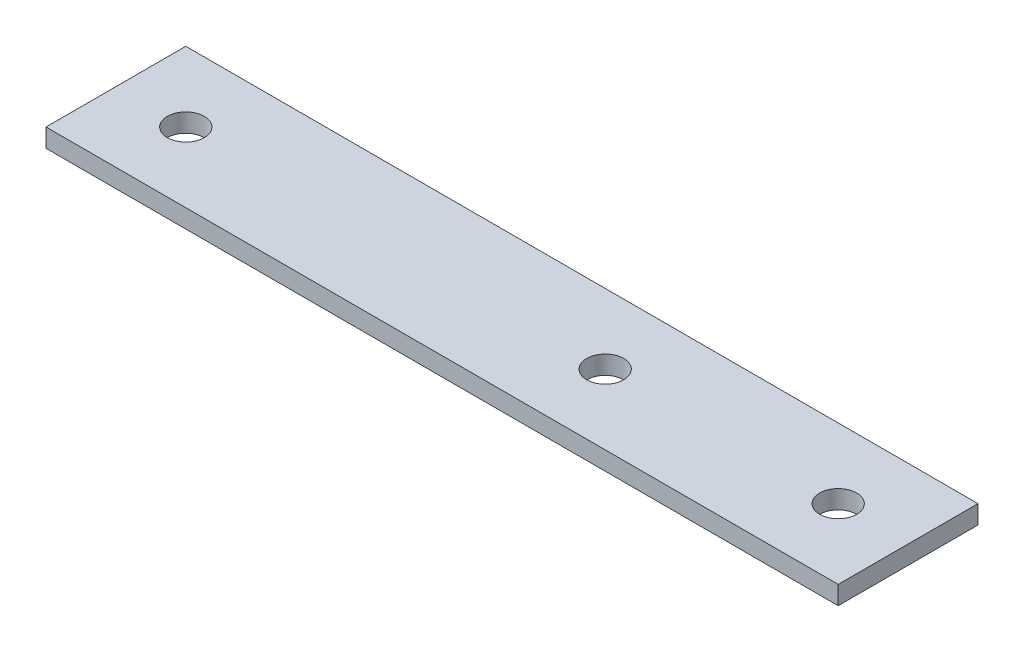
ISO-10303-21;
HEADER;
FILE_DESCRIPTION(('STEP AP214'),'2;1');
FILE_NAME('part.step','',(''),(''),'','','');
FILE_SCHEMA(('AUTOMOTIVE_DESIGN { 1 0 10303 214 1 1 1 1 }'));
ENDSEC;
DATA;
#1=APPLICATION_CONTEXT('core data for automotive mechanical design processes');
#2=APPLICATION_PROTOCOL_DEFINITION('international standard','automotive_design',2000,#1);
#3=PRODUCT_CONTEXT('',#1,'mechanical');
#4=PRODUCT('Part','Part','',(#3));
#5=PRODUCT_RELATED_PRODUCT_CATEGORY('part','',(#4));
#6=PRODUCT_DEFINITION_FORMATION('','',#4);
#7=PRODUCT_DEFINITION_CONTEXT('part definition',#1,'design');
#8=PRODUCT_DEFINITION('design','',#6,#7);
#9=PRODUCT_DEFINITION_SHAPE('','',#8);
#10=(LENGTH_UNIT() NAMED_UNIT(*) SI_UNIT(.MILLI.,.METRE.));
#11=(NAMED_UNIT(*) PLANE_ANGLE_UNIT() SI_UNIT($,.RADIAN.));
#12=(NAMED_UNIT(*) SI_UNIT($,.STERADIAN.) SOLID_ANGLE_UNIT());
#13=UNCERTAINTY_MEASURE_WITH_UNIT(LENGTH_MEASURE(1.E-05),#10,'distance_accuracy_value','');
#14=(GEOMETRIC_REPRESENTATION_CONTEXT(3) GLOBAL_UNCERTAINTY_ASSIGNED_CONTEXT((#13)) GLOBAL_UNIT_ASSIGNED_CONTEXT((#10,
#11,#12)) REPRESENTATION_CONTEXT('',''));
#15=CARTESIAN_POINT('',(0.,0.,0.));
#16=DIRECTION('',(0.,0.,1.));
#17=DIRECTION('',(1.,0.,0.));
#18=AXIS2_PLACEMENT_3D('',#15,#16,#17);
#19=CARTESIAN_POINT('',(0.,0.79375,0.));
#20=DIRECTION('',(0.,1.,0.));
#21=DIRECTION('',(0.,0.,1.));
#22=AXIS2_PLACEMENT_3D('',#19,#20,#21);
#23=PLANE('',#22);
#24=CARTESIAN_POINT('',(28.,0.79375,0.));
#25=DIRECTION('',(0.,1.,0.));
#26=DIRECTION('',(0.,0.,1.));
#27=AXIS2_PLACEMENT_3D('',#24,#25,#26);
#28=CIRCLE('',#27,1.5875);
#29=CARTESIAN_POINT('',(28.,0.79375,1.5875));
#30=VERTEX_POINT('',#29);
#31=EDGE_CURVE('E114',#30,#30,#28,.T.);
#32=ORIENTED_EDGE('',*,*,#31,.F.);
#33=EDGE_LOOP('',(#32));
#34=FACE_BOUND('',#33,.T.);
#35=DIRECTION('',(0.,0.,1.));
#36=VECTOR('',#35,1.);
#37=CARTESIAN_POINT('',(-34.,0.79375,6.));
#38=LINE('',#37,#36);
#39=CARTESIAN_POINT('',(-34.,0.79375,-6.));
#40=VERTEX_POINT('',#39);
#41=CARTESIAN_POINT('',(-34.,0.79375,6.));
#42=VERTEX_POINT('',#41);
#43=EDGE_CURVE('E84',#40,#42,#38,.T.);
#44=ORIENTED_EDGE('',*,*,#43,.T.);
#45=DIRECTION('',(1.,0.,0.));
#46=VECTOR('',#45,1.);
#47=CARTESIAN_POINT('',(34.,0.79375,6.));
#48=LINE('',#47,#46);
#49=CARTESIAN_POINT('',(34.,0.79375,6.));
#50=VERTEX_POINT('',#49);
#51=EDGE_CURVE('E79',#42,#50,#48,.T.);
#52=ORIENTED_EDGE('',*,*,#51,.T.);
#53=DIRECTION('',(0.,0.,-1.));
#54=VECTOR('',#53,1.);
#55=CARTESIAN_POINT('',(34.,0.79375,6.));
#56=LINE('',#55,#54);
#57=CARTESIAN_POINT('',(34.,0.79375,-6.));
#58=VERTEX_POINT('',#57);
#59=EDGE_CURVE('E82',#50,#58,#56,.T.);
#60=ORIENTED_EDGE('',*,*,#59,.T.);
#61=DIRECTION('',(-1.,0.,0.));
#62=VECTOR('',#61,1.);
#63=CARTESIAN_POINT('',(34.,0.79375,-6.));
#64=LINE('',#63,#62);
#65=EDGE_CURVE('E49',#58,#40,#64,.T.);
#66=ORIENTED_EDGE('',*,*,#65,.T.);
#67=EDGE_LOOP('',(#44,#52,#60,#66));
#68=FACE_BOUND('',#67,.T.);
#69=CARTESIAN_POINT('',(-28.,0.79375,0.));
#70=DIRECTION('',(0.,1.,0.));
#71=DIRECTION('',(0.,0.,1.));
#72=AXIS2_PLACEMENT_3D('',#69,#70,#71);
#73=CIRCLE('',#72,1.5875);
#74=CARTESIAN_POINT('',(-28.,0.79375,1.5875));
#75=VERTEX_POINT('',#74);
#76=EDGE_CURVE('E99',#75,#75,#73,.T.);
#77=ORIENTED_EDGE('',*,*,#76,.F.);
#78=EDGE_LOOP('',(#77));
#79=FACE_BOUND('',#78,.T.);
#80=CARTESIAN_POINT('',(8.,0.79375,0.));
#81=DIRECTION('',(0.,1.,0.));
#82=DIRECTION('',(0.,0.,1.));
#83=AXIS2_PLACEMENT_3D('',#80,#81,#82);
#84=CIRCLE('',#83,1.5875);
#85=CARTESIAN_POINT('',(8.,0.79375,1.5875));
#86=VERTEX_POINT('',#85);
#87=EDGE_CURVE('E120',#86,#86,#84,.T.);
#88=ORIENTED_EDGE('',*,*,#87,.F.);
#89=EDGE_LOOP('',(#88));
#90=FACE_BOUND('',#89,.T.);
#91=ADVANCED_FACE('F32',(#34,#68,#79,#90),#23,.T.);
#92=CARTESIAN_POINT('',(0.,-0.79375,0.));
#93=DIRECTION('',(0.,1.,0.));
#94=DIRECTION('',(0.,0.,1.));
#95=AXIS2_PLACEMENT_3D('',#92,#93,#94);
#96=PLANE('',#95);
#97=CARTESIAN_POINT('',(28.,-0.79375,0.));
#98=DIRECTION('',(0.,1.,0.));
#99=DIRECTION('',(0.,0.,1.));
#100=AXIS2_PLACEMENT_3D('',#97,#98,#99);
#101=CIRCLE('',#100,1.5875);
#102=CARTESIAN_POINT('',(28.,-0.79375,1.5875));
#103=VERTEX_POINT('',#102);
#104=EDGE_CURVE('E117',#103,#103,#101,.T.);
#105=ORIENTED_EDGE('',*,*,#104,.T.);
#106=EDGE_LOOP('',(#105));
#107=FACE_BOUND('',#106,.T.);
#108=DIRECTION('',(0.,0.,1.));
#109=VECTOR('',#108,1.);
#110=CARTESIAN_POINT('',(-34.,-0.79375,6.));
#111=LINE('',#110,#109);
#112=CARTESIAN_POINT('',(-34.,-0.79375,-6.));
#113=VERTEX_POINT('',#112);
#114=CARTESIAN_POINT('',(-34.,-0.79375,6.));
#115=VERTEX_POINT('',#114);
#116=EDGE_CURVE('E96',#113,#115,#111,.T.);
#117=ORIENTED_EDGE('',*,*,#116,.F.);
#118=DIRECTION('',(-1.,0.,0.));
#119=VECTOR('',#118,1.);
#120=CARTESIAN_POINT('',(34.,-0.79375,-6.));
#121=LINE('',#120,#119);
#122=CARTESIAN_POINT('',(34.,-0.79375,-6.));
#123=VERTEX_POINT('',#122);
#124=EDGE_CURVE('E72',#123,#113,#121,.T.);
#125=ORIENTED_EDGE('',*,*,#124,.F.);
#126=DIRECTION('',(0.,0.,-1.));
#127=VECTOR('',#126,1.);
#128=CARTESIAN_POINT('',(34.,-0.79375,6.));
#129=LINE('',#128,#127);
#130=CARTESIAN_POINT('',(34.,-0.79375,6.));
#131=VERTEX_POINT('',#130);
#132=EDGE_CURVE('E66',#131,#123,#129,.T.);
#133=ORIENTED_EDGE('',*,*,#132,.F.);
#134=DIRECTION('',(1.,0.,0.));
#135=VECTOR('',#134,1.);
#136=CARTESIAN_POINT('',(34.,-0.79375,6.));
#137=LINE('',#136,#135);
#138=EDGE_CURVE('E88',#115,#131,#137,.T.);
#139=ORIENTED_EDGE('',*,*,#138,.F.);
#140=EDGE_LOOP('',(#117,#125,#133,#139));
#141=FACE_BOUND('',#140,.T.);
#142=CARTESIAN_POINT('',(-28.,-0.79375,0.));
#143=DIRECTION('',(0.,1.,0.));
#144=DIRECTION('',(0.,0.,1.));
#145=AXIS2_PLACEMENT_3D('',#142,#143,#144);
#146=CIRCLE('',#145,1.5875);
#147=CARTESIAN_POINT('',(-28.,-0.79375,1.5875));
#148=VERTEX_POINT('',#147);
#149=EDGE_CURVE('E111',#148,#148,#146,.T.);
#150=ORIENTED_EDGE('',*,*,#149,.T.);
#151=EDGE_LOOP('',(#150));
#152=FACE_BOUND('',#151,.T.);
#153=CARTESIAN_POINT('',(8.,-0.79375,0.));
#154=DIRECTION('',(0.,1.,0.));
#155=DIRECTION('',(0.,0.,1.));
#156=AXIS2_PLACEMENT_3D('',#153,#154,#155);
#157=CIRCLE('',#156,1.5875);
#158=CARTESIAN_POINT('',(8.,-0.79375,1.5875));
#159=VERTEX_POINT('',#158);
#160=EDGE_CURVE('E123',#159,#159,#157,.T.);
#161=ORIENTED_EDGE('',*,*,#160,.T.);
#162=EDGE_LOOP('',(#161));
#163=FACE_BOUND('',#162,.T.);
#164=ADVANCED_FACE('F107',(#107,#141,#152,#163),#96,.F.);
#165=CARTESIAN_POINT('',(-34.,0.79375,6.));
#166=DIRECTION('',(1.,0.,0.));
#167=DIRECTION('',(0.,0.,-1.));
#168=AXIS2_PLACEMENT_3D('',#165,#166,#167);
#169=PLANE('',#168);
#170=ORIENTED_EDGE('',*,*,#116,.T.);
#171=DIRECTION('',(0.,-1.,0.));
#172=VECTOR('',#171,1.);
#173=CARTESIAN_POINT('',(-34.,0.79375,6.));
#174=LINE('',#173,#172);
#175=EDGE_CURVE('E11',#42,#115,#174,.T.);
#176=ORIENTED_EDGE('',*,*,#175,.F.);
#177=ORIENTED_EDGE('',*,*,#43,.F.);
#178=DIRECTION('',(0.,-1.,0.));
#179=VECTOR('',#178,1.);
#180=CARTESIAN_POINT('',(-34.,0.79375,-6.));
#181=LINE('',#180,#179);
#182=EDGE_CURVE('E92',#40,#113,#181,.T.);
#183=ORIENTED_EDGE('',*,*,#182,.T.);
#184=EDGE_LOOP('',(#170,#176,#177,#183));
#185=FACE_BOUND('',#184,.T.);
#186=ADVANCED_FACE('F34',(#185),#169,.F.);
#187=CARTESIAN_POINT('',(34.,0.79375,6.));
#188=DIRECTION('',(0.,0.,-1.));
#189=DIRECTION('',(-1.,0.,0.));
#190=AXIS2_PLACEMENT_3D('',#187,#188,#189);
#191=PLANE('',#190);
#192=ORIENTED_EDGE('',*,*,#138,.T.);
#193=DIRECTION('',(0.,-1.,0.));
#194=VECTOR('',#193,1.);
#195=CARTESIAN_POINT('',(34.,0.79375,6.));
#196=LINE('',#195,#194);
#197=EDGE_CURVE('E41',#50,#131,#196,.T.);
#198=ORIENTED_EDGE('',*,*,#197,.F.);
#199=ORIENTED_EDGE('',*,*,#51,.F.);
#200=ORIENTED_EDGE('',*,*,#175,.T.);
#201=EDGE_LOOP('',(#192,#198,#199,#200));
#202=FACE_BOUND('',#201,.T.);
#203=ADVANCED_FACE('F87',(#202),#191,.F.);
#204=CARTESIAN_POINT('',(34.,0.79375,6.));
#205=DIRECTION('',(-1.,0.,0.));
#206=DIRECTION('',(0.,0.,1.));
#207=AXIS2_PLACEMENT_3D('',#204,#205,#206);
#208=PLANE('',#207);
#209=ORIENTED_EDGE('',*,*,#132,.T.);
#210=DIRECTION('',(0.,-1.,0.));
#211=VECTOR('',#210,1.);
#212=CARTESIAN_POINT('',(34.,0.79375,-6.));
#213=LINE('',#212,#211);
#214=EDGE_CURVE('E89',#58,#123,#213,.T.);
#215=ORIENTED_EDGE('',*,*,#214,.F.);
#216=ORIENTED_EDGE('',*,*,#59,.F.);
#217=ORIENTED_EDGE('',*,*,#197,.T.);
#218=EDGE_LOOP('',(#209,#215,#216,#217));
#219=FACE_BOUND('',#218,.T.);
#220=ADVANCED_FACE('F90',(#219),#208,.F.);
#221=CARTESIAN_POINT('',(34.,0.79375,-6.));
#222=DIRECTION('',(0.,0.,1.));
#223=DIRECTION('',(1.,0.,0.));
#224=AXIS2_PLACEMENT_3D('',#221,#222,#223);
#225=PLANE('',#224);
#226=ORIENTED_EDGE('',*,*,#124,.T.);
#227=ORIENTED_EDGE('',*,*,#182,.F.);
#228=ORIENTED_EDGE('',*,*,#65,.F.);
#229=ORIENTED_EDGE('',*,*,#214,.T.);
#230=EDGE_LOOP('',(#226,#227,#228,#229));
#231=FACE_BOUND('',#230,.T.);
#232=ADVANCED_FACE('F104',(#231),#225,.F.);
#233=CARTESIAN_POINT('',(-28.,0.79375,0.));
#234=DIRECTION('',(0.,-1.,0.));
#235=DIRECTION('',(0.,0.,-1.));
#236=AXIS2_PLACEMENT_3D('',#233,#234,#235);
#237=CYLINDRICAL_SURFACE('',#236,1.5875);
#238=ORIENTED_EDGE('',*,*,#76,.T.);
#239=EDGE_LOOP('',(#238));
#240=FACE_BOUND('',#239,.T.);
#241=ORIENTED_EDGE('',*,*,#149,.F.);
#242=EDGE_LOOP('',(#241));
#243=FACE_BOUND('',#242,.T.);
#244=ADVANCED_FACE('F142',(#240,#243),#237,.F.);
#245=CARTESIAN_POINT('',(28.,0.79375,0.));
#246=DIRECTION('',(0.,-1.,0.));
#247=DIRECTION('',(0.,0.,-1.));
#248=AXIS2_PLACEMENT_3D('',#245,#246,#247);
#249=CYLINDRICAL_SURFACE('',#248,1.5875);
#250=ORIENTED_EDGE('',*,*,#31,.T.);
#251=EDGE_LOOP('',(#250));
#252=FACE_BOUND('',#251,.T.);
#253=ORIENTED_EDGE('',*,*,#104,.F.);
#254=EDGE_LOOP('',(#253));
#255=FACE_BOUND('',#254,.T.);
#256=ADVANCED_FACE('F188',(#252,#255),#249,.F.);
#257=CARTESIAN_POINT('',(8.,0.79375,0.));
#258=DIRECTION('',(0.,-1.,0.));
#259=DIRECTION('',(0.,0.,-1.));
#260=AXIS2_PLACEMENT_3D('',#257,#258,#259);
#261=CYLINDRICAL_SURFACE('',#260,1.5875);
#262=ORIENTED_EDGE('',*,*,#87,.T.);
#263=EDGE_LOOP('',(#262));
#264=FACE_BOUND('',#263,.T.);
#265=ORIENTED_EDGE('',*,*,#160,.F.);
#266=EDGE_LOOP('',(#265));
#267=FACE_BOUND('',#266,.T.);
#268=ADVANCED_FACE('F129',(#264,#267),#261,.F.);
#269=CLOSED_SHELL('',(#91,#164,#186,#203,#220,#232,#244,#256,#268));
#270=MANIFOLD_SOLID_BREP('B2',#269);
#271=ADVANCED_BREP_SHAPE_REPRESENTATION('',(#18,#270),#14);
#272=SHAPE_DEFINITION_REPRESENTATION(#9,#271);
ENDSEC;
END-ISO-10303-21;
